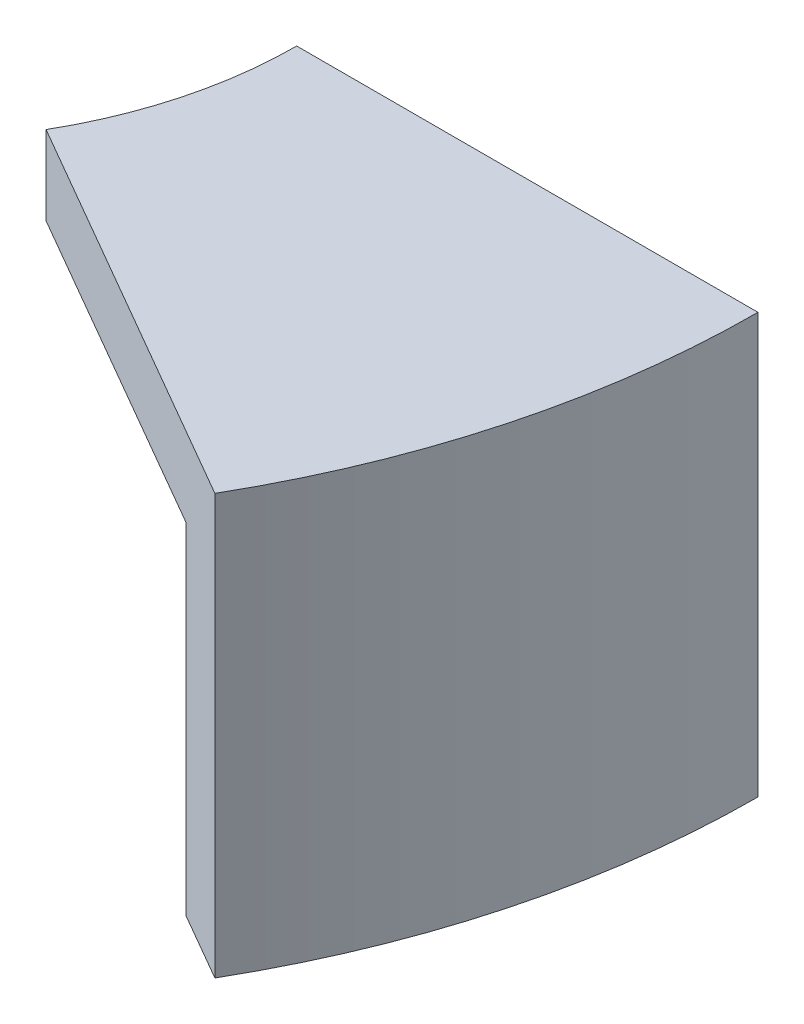
ISO-10303-21;
HEADER;
FILE_DESCRIPTION(('STEP AP214'),'2;1');
FILE_NAME('part.step','',(''),(''),'','','');
FILE_SCHEMA(('AUTOMOTIVE_DESIGN { 1 0 10303 214 1 1 1 1 }'));
ENDSEC;
DATA;
#1=APPLICATION_CONTEXT('core data for automotive mechanical design processes');
#2=APPLICATION_PROTOCOL_DEFINITION('international standard','automotive_design',2000,#1);
#3=PRODUCT_CONTEXT('',#1,'mechanical');
#4=PRODUCT('Part','Part','',(#3));
#5=PRODUCT_RELATED_PRODUCT_CATEGORY('part','',(#4));
#6=PRODUCT_DEFINITION_FORMATION('','',#4);
#7=PRODUCT_DEFINITION_CONTEXT('part definition',#1,'design');
#8=PRODUCT_DEFINITION('design','',#6,#7);
#9=PRODUCT_DEFINITION_SHAPE('','',#8);
#10=(LENGTH_UNIT() NAMED_UNIT(*) SI_UNIT(.MILLI.,.METRE.));
#11=(NAMED_UNIT(*) PLANE_ANGLE_UNIT() SI_UNIT($,.RADIAN.));
#12=(NAMED_UNIT(*) SI_UNIT($,.STERADIAN.) SOLID_ANGLE_UNIT());
#13=UNCERTAINTY_MEASURE_WITH_UNIT(LENGTH_MEASURE(1.E-05),#10,'distance_accuracy_value','');
#14=(GEOMETRIC_REPRESENTATION_CONTEXT(3) GLOBAL_UNCERTAINTY_ASSIGNED_CONTEXT((#13)) GLOBAL_UNIT_ASSIGNED_CONTEXT((#10,
#11,#12)) REPRESENTATION_CONTEXT('',''));
#15=CARTESIAN_POINT('',(0.,0.,0.));
#16=DIRECTION('',(0.,0.,1.));
#17=DIRECTION('',(1.,0.,0.));
#18=AXIS2_PLACEMENT_3D('',#15,#16,#17);
#19=CARTESIAN_POINT('',(267.869910117413,911.559895472208,0.));
#20=DIRECTION('',(0.,1.,0.));
#21=DIRECTION('',(0.,0.,1.));
#22=AXIS2_PLACEMENT_3D('',#19,#20,#21);
#23=CYLINDRICAL_SURFACE('',#22,30.);
#24=CARTESIAN_POINT('',(267.869910117413,900.559895472208,0.));
#25=DIRECTION('',(0.,1.,0.));
#26=DIRECTION('',(0.,0.,1.));
#27=AXIS2_PLACEMENT_3D('',#24,#25,#26);
#28=CIRCLE('',#27,30.);
#29=CARTESIAN_POINT('',(293.850672230946,900.559895472208,15.));
#30=VERTEX_POINT('',#29);
#31=CARTESIAN_POINT('',(297.869910117413,900.559895472208,0.));
#32=VERTEX_POINT('',#31);
#33=EDGE_CURVE('E11',#30,#32,#28,.T.);
#34=ORIENTED_EDGE('',*,*,#33,.F.);
#35=DIRECTION('',(0.,-1.,0.));
#36=VECTOR('',#35,1.);
#37=CARTESIAN_POINT('',(293.850672230946,906.559895472208,15.));
#38=LINE('',#37,#36);
#39=CARTESIAN_POINT('',(293.850672230946,906.559895472208,15.));
#40=VERTEX_POINT('',#39);
#41=EDGE_CURVE('E128',#40,#30,#38,.T.);
#42=ORIENTED_EDGE('',*,*,#41,.F.);
#43=CARTESIAN_POINT('',(267.869910117413,906.559895472208,0.));
#44=DIRECTION('',(0.,1.,0.));
#45=DIRECTION('',(0.,0.,1.));
#46=AXIS2_PLACEMENT_3D('',#43,#44,#45);
#47=CIRCLE('',#46,30.);
#48=CARTESIAN_POINT('',(297.869910117413,906.559895472208,0.));
#49=VERTEX_POINT('',#48);
#50=EDGE_CURVE('E55',#40,#49,#47,.T.);
#51=ORIENTED_EDGE('',*,*,#50,.T.);
#52=DIRECTION('',(0.,-1.,0.));
#53=VECTOR('',#52,1.);
#54=CARTESIAN_POINT('',(297.869910117413,906.559895472208,0.));
#55=LINE('',#54,#53);
#56=EDGE_CURVE('E104',#49,#32,#55,.T.);
#57=ORIENTED_EDGE('',*,*,#56,.T.);
#58=EDGE_LOOP('',(#34,#42,#51,#57));
#59=FACE_BOUND('',#58,.T.);
#60=ADVANCED_FACE('F39',(#59),#23,.F.);
#61=CARTESIAN_POINT('',(293.850672230946,900.559895472208,15.));
#62=DIRECTION('',(0.,1.,0.));
#63=DIRECTION('',(0.,0.,1.));
#64=AXIS2_PLACEMENT_3D('',#61,#62,#63);
#65=PLANE('',#64);
#66=CARTESIAN_POINT('',(267.869910117413,900.559895472208,0.));
#67=DIRECTION('',(0.,1.,0.));
#68=DIRECTION('',(0.,0.,1.));
#69=AXIS2_PLACEMENT_3D('',#66,#67,#68);
#70=CIRCLE('',#69,59.);
#71=CARTESIAN_POINT('',(318.965408940695,900.559895472208,29.5000000000001));
#72=VERTEX_POINT('',#71);
#73=CARTESIAN_POINT('',(326.869910117413,900.559895472208,0.));
#74=VERTEX_POINT('',#73);
#75=EDGE_CURVE('E48',#72,#74,#70,.T.);
#76=ORIENTED_EDGE('',*,*,#75,.F.);
#77=DIRECTION('',(0.866025403784438,0.,0.500000000000001));
#78=VECTOR('',#77,1.);
#79=CARTESIAN_POINT('',(293.850672230946,900.559895472208,15.));
#80=LINE('',#79,#78);
#81=EDGE_CURVE('E100',#30,#72,#80,.T.);
#82=ORIENTED_EDGE('',*,*,#81,.F.);
#83=ORIENTED_EDGE('',*,*,#33,.T.);
#84=DIRECTION('',(1.,0.,0.));
#85=VECTOR('',#84,1.);
#86=CARTESIAN_POINT('',(297.869910117413,900.559895472208,0.));
#87=LINE('',#86,#85);
#88=EDGE_CURVE('E97',#32,#74,#87,.T.);
#89=ORIENTED_EDGE('',*,*,#88,.T.);
#90=EDGE_LOOP('',(#76,#82,#83,#89));
#91=FACE_BOUND('',#90,.T.);
#92=ADVANCED_FACE('F41',(#91),#65,.F.);
#93=CARTESIAN_POINT('',(267.869910117413,911.559895472208,0.));
#94=DIRECTION('',(0.,1.,0.));
#95=DIRECTION('',(0.,0.,1.));
#96=AXIS2_PLACEMENT_3D('',#93,#94,#95);
#97=CYLINDRICAL_SURFACE('',#96,59.);
#98=CARTESIAN_POINT('',(267.869910117413,874.709371179833,0.));
#99=DIRECTION('',(0.,1.,0.));
#100=DIRECTION('',(0.,0.,1.));
#101=AXIS2_PLACEMENT_3D('',#98,#99,#100);
#102=CIRCLE('',#101,59.);
#103=CARTESIAN_POINT('',(318.965408940695,874.709371179833,29.5000000000001));
#104=VERTEX_POINT('',#103);
#105=CARTESIAN_POINT('',(326.869910117413,874.709371179833,0.));
#106=VERTEX_POINT('',#105);
#107=EDGE_CURVE('E154',#104,#106,#102,.T.);
#108=ORIENTED_EDGE('',*,*,#107,.F.);
#109=DIRECTION('',(0.,-1.,0.));
#110=VECTOR('',#109,1.);
#111=CARTESIAN_POINT('',(318.965408940695,900.559895472208,29.5000000000001));
#112=LINE('',#111,#110);
#113=EDGE_CURVE('E133',#72,#104,#112,.T.);
#114=ORIENTED_EDGE('',*,*,#113,.F.);
#115=ORIENTED_EDGE('',*,*,#75,.T.);
#116=DIRECTION('',(0.,-1.,0.));
#117=VECTOR('',#116,1.);
#118=CARTESIAN_POINT('',(326.869910117413,900.559895472208,0.));
#119=LINE('',#118,#117);
#120=EDGE_CURVE('E112',#74,#106,#119,.T.);
#121=ORIENTED_EDGE('',*,*,#120,.T.);
#122=EDGE_LOOP('',(#108,#114,#115,#121));
#123=FACE_BOUND('',#122,.T.);
#124=ADVANCED_FACE('F159',(#123),#97,.F.);
#125=CARTESIAN_POINT('',(318.965408940695,874.709371179833,29.5000000000001));
#126=DIRECTION('',(0.,1.,0.));
#127=DIRECTION('',(0.,0.,1.));
#128=AXIS2_PLACEMENT_3D('',#125,#126,#127);
#129=PLANE('',#128);
#130=CARTESIAN_POINT('',(267.869910117413,874.709371179833,0.));
#131=DIRECTION('',(0.,1.,0.));
#132=DIRECTION('',(0.,0.,1.));
#133=AXIS2_PLACEMENT_3D('',#130,#131,#132);
#134=CIRCLE('',#133,65.);
#135=CARTESIAN_POINT('',(324.161561363401,874.709371179833,32.5000000000001));
#136=VERTEX_POINT('',#135);
#137=CARTESIAN_POINT('',(332.869910117413,874.709371179833,0.));
#138=VERTEX_POINT('',#137);
#139=EDGE_CURVE('E151',#136,#138,#134,.T.);
#140=ORIENTED_EDGE('',*,*,#139,.F.);
#141=DIRECTION('',(0.866025403784438,0.,0.500000000000001));
#142=VECTOR('',#141,1.);
#143=CARTESIAN_POINT('',(318.965408940695,874.709371179833,29.5000000000001));
#144=LINE('',#143,#142);
#145=EDGE_CURVE('E137',#104,#136,#144,.T.);
#146=ORIENTED_EDGE('',*,*,#145,.F.);
#147=ORIENTED_EDGE('',*,*,#107,.T.);
#148=DIRECTION('',(1.,0.,0.));
#149=VECTOR('',#148,1.);
#150=CARTESIAN_POINT('',(326.869910117413,874.709371179833,0.));
#151=LINE('',#150,#149);
#152=EDGE_CURVE('E116',#106,#138,#151,.T.);
#153=ORIENTED_EDGE('',*,*,#152,.T.);
#154=EDGE_LOOP('',(#140,#146,#147,#153));
#155=FACE_BOUND('',#154,.T.);
#156=ADVANCED_FACE('F167',(#155),#129,.F.);
#157=CARTESIAN_POINT('',(267.869910117413,911.559895472208,0.));
#158=DIRECTION('',(0.,1.,0.));
#159=DIRECTION('',(0.,0.,1.));
#160=AXIS2_PLACEMENT_3D('',#157,#158,#159);
#161=CYLINDRICAL_SURFACE('',#160,65.);
#162=CARTESIAN_POINT('',(267.869910117413,906.559895472208,0.));
#163=DIRECTION('',(0.,1.,0.));
#164=DIRECTION('',(0.,0.,1.));
#165=AXIS2_PLACEMENT_3D('',#162,#163,#164);
#166=CIRCLE('',#165,65.);
#167=CARTESIAN_POINT('',(324.161561363401,906.559895472208,32.5000000000001));
#168=VERTEX_POINT('',#167);
#169=CARTESIAN_POINT('',(332.869910117413,906.559895472208,0.));
#170=VERTEX_POINT('',#169);
#171=EDGE_CURVE('E147',#168,#170,#166,.T.);
#172=ORIENTED_EDGE('',*,*,#171,.F.);
#173=DIRECTION('',(0.,1.,0.));
#174=VECTOR('',#173,1.);
#175=CARTESIAN_POINT('',(324.161561363401,902.559895472208,32.5000000000001));
#176=LINE('',#175,#174);
#177=EDGE_CURVE('E63',#136,#168,#176,.T.);
#178=ORIENTED_EDGE('',*,*,#177,.F.);
#179=ORIENTED_EDGE('',*,*,#139,.T.);
#180=DIRECTION('',(0.,1.,0.));
#181=VECTOR('',#180,1.);
#182=CARTESIAN_POINT('',(332.869910117413,902.559895472208,0.));
#183=LINE('',#182,#181);
#184=EDGE_CURVE('E122',#138,#170,#183,.T.);
#185=ORIENTED_EDGE('',*,*,#184,.T.);
#186=EDGE_LOOP('',(#172,#178,#179,#185));
#187=FACE_BOUND('',#186,.T.);
#188=ADVANCED_FACE('F165',(#187),#161,.T.);
#189=CARTESIAN_POINT('',(293.850672230946,906.559895472208,15.));
#190=DIRECTION('',(0.,-1.,0.));
#191=DIRECTION('',(0.,0.,-1.));
#192=AXIS2_PLACEMENT_3D('',#189,#190,#191);
#193=PLANE('',#192);
#194=DIRECTION('',(-0.866025403784438,0.,-0.500000000000001));
#195=VECTOR('',#194,1.);
#196=CARTESIAN_POINT('',(293.850672230946,906.559895472208,15.));
#197=LINE('',#196,#195);
#198=EDGE_CURVE('E142',#168,#40,#197,.T.);
#199=ORIENTED_EDGE('',*,*,#198,.F.);
#200=ORIENTED_EDGE('',*,*,#171,.T.);
#201=DIRECTION('',(-1.,0.,0.));
#202=VECTOR('',#201,1.);
#203=CARTESIAN_POINT('',(297.869910117413,906.559895472208,0.));
#204=LINE('',#203,#202);
#205=EDGE_CURVE('E125',#170,#49,#204,.T.);
#206=ORIENTED_EDGE('',*,*,#205,.T.);
#207=ORIENTED_EDGE('',*,*,#50,.F.);
#208=EDGE_LOOP('',(#199,#200,#206,#207));
#209=FACE_BOUND('',#208,.T.);
#210=ADVANCED_FACE('F162',(#209),#193,.F.);
#211=CARTESIAN_POINT('',(35.8877630462792,0.,-133.934955058707));
#212=DIRECTION('',(-0.500000000000001,0.,0.866025403784438));
#213=DIRECTION('',(0.866025403784438,0.,0.500000000000001));
#214=AXIS2_PLACEMENT_3D('',#211,#212,#213);
#215=PLANE('',#214);
#216=ORIENTED_EDGE('',*,*,#41,.T.);
#217=ORIENTED_EDGE('',*,*,#81,.T.);
#218=ORIENTED_EDGE('',*,*,#113,.T.);
#219=ORIENTED_EDGE('',*,*,#145,.T.);
#220=ORIENTED_EDGE('',*,*,#177,.T.);
#221=ORIENTED_EDGE('',*,*,#198,.T.);
#222=EDGE_LOOP('',(#216,#217,#218,#219,#220,#221));
#223=FACE_BOUND('',#222,.T.);
#224=ADVANCED_FACE('F160',(#223),#215,.T.);
#225=CARTESIAN_POINT('',(0.,0.,0.));
#226=DIRECTION('',(0.,0.,1.));
#227=DIRECTION('',(1.,0.,0.));
#228=AXIS2_PLACEMENT_3D('',#225,#226,#227);
#229=PLANE('',#228);
#230=ORIENTED_EDGE('',*,*,#56,.F.);
#231=ORIENTED_EDGE('',*,*,#205,.F.);
#232=ORIENTED_EDGE('',*,*,#184,.F.);
#233=ORIENTED_EDGE('',*,*,#152,.F.);
#234=ORIENTED_EDGE('',*,*,#120,.F.);
#235=ORIENTED_EDGE('',*,*,#88,.F.);
#236=EDGE_LOOP('',(#230,#231,#232,#233,#234,#235));
#237=FACE_BOUND('',#236,.T.);
#238=ADVANCED_FACE('F109',(#237),#229,.F.);
#239=CLOSED_SHELL('',(#60,#92,#124,#156,#188,#210,#224,#238));
#240=MANIFOLD_SOLID_BREP('B2',#239);
#241=ADVANCED_BREP_SHAPE_REPRESENTATION('',(#18,#240),#14);
#242=SHAPE_DEFINITION_REPRESENTATION(#9,#241);
ENDSEC;
END-ISO-10303-21;
